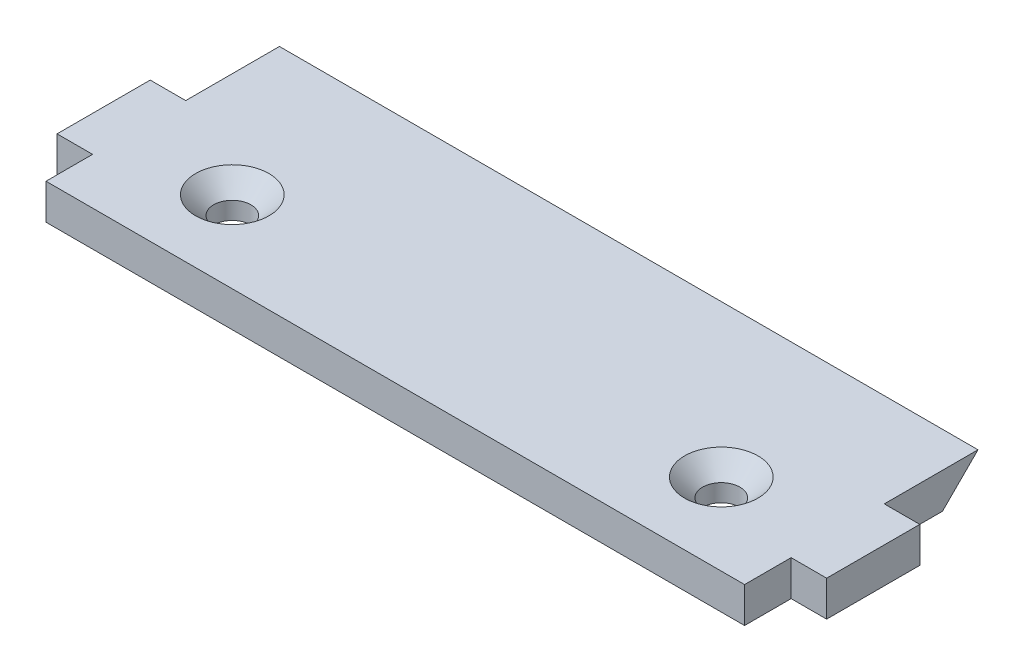
ISO-10303-21;
HEADER;
FILE_DESCRIPTION(('STEP AP214'),'2;1');
FILE_NAME('part.step','',(''),(''),'','','');
FILE_SCHEMA(('AUTOMOTIVE_DESIGN { 1 0 10303 214 1 1 1 1 }'));
ENDSEC;
DATA;
#1=APPLICATION_CONTEXT('core data for automotive mechanical design processes');
#2=APPLICATION_PROTOCOL_DEFINITION('international standard','automotive_design',2000,#1);
#3=PRODUCT_CONTEXT('',#1,'mechanical');
#4=PRODUCT('Part','Part','',(#3));
#5=PRODUCT_RELATED_PRODUCT_CATEGORY('part','',(#4));
#6=PRODUCT_DEFINITION_FORMATION('','',#4);
#7=PRODUCT_DEFINITION_CONTEXT('part definition',#1,'design');
#8=PRODUCT_DEFINITION('design','',#6,#7);
#9=PRODUCT_DEFINITION_SHAPE('','',#8);
#10=(LENGTH_UNIT() NAMED_UNIT(*) SI_UNIT(.MILLI.,.METRE.));
#11=(NAMED_UNIT(*) PLANE_ANGLE_UNIT() SI_UNIT($,.RADIAN.));
#12=(NAMED_UNIT(*) SI_UNIT($,.STERADIAN.) SOLID_ANGLE_UNIT());
#13=UNCERTAINTY_MEASURE_WITH_UNIT(LENGTH_MEASURE(1.E-05),#10,'distance_accuracy_value','');
#14=(GEOMETRIC_REPRESENTATION_CONTEXT(3) GLOBAL_UNCERTAINTY_ASSIGNED_CONTEXT((#13)) GLOBAL_UNIT_ASSIGNED_CONTEXT((#10,
#11,#12)) REPRESENTATION_CONTEXT('',''));
#15=CARTESIAN_POINT('',(0.,0.,0.));
#16=DIRECTION('',(0.,0.,1.));
#17=DIRECTION('',(1.,0.,0.));
#18=AXIS2_PLACEMENT_3D('',#15,#16,#17);
#19=CARTESIAN_POINT('',(66.1,3.05,0.));
#20=DIRECTION('',(-1.,0.,0.));
#21=DIRECTION('',(0.,0.,1.));
#22=AXIS2_PLACEMENT_3D('',#19,#20,#21);
#23=PLANE('',#22);
#24=DIRECTION('',(0.,0.,-1.));
#25=VECTOR('',#24,1.);
#26=CARTESIAN_POINT('',(66.1,0.,0.));
#27=LINE('',#26,#25);
#28=CARTESIAN_POINT('',(66.1,0.,-4.));
#29=VERTEX_POINT('',#28);
#30=CARTESIAN_POINT('',(66.1,0.,-12.));
#31=VERTEX_POINT('',#30);
#32=EDGE_CURVE('E170',#29,#31,#27,.T.);
#33=ORIENTED_EDGE('',*,*,#32,.T.);
#34=DIRECTION('',(0.,-1.,0.));
#35=VECTOR('',#34,1.);
#36=CARTESIAN_POINT('',(66.1,3.05,-12.));
#37=LINE('',#36,#35);
#38=CARTESIAN_POINT('',(66.1,3.05,-12.));
#39=VERTEX_POINT('',#38);
#40=EDGE_CURVE('E53',#39,#31,#37,.T.);
#41=ORIENTED_EDGE('',*,*,#40,.F.);
#42=DIRECTION('',(0.,0.,-1.));
#43=VECTOR('',#42,1.);
#44=CARTESIAN_POINT('',(66.1,3.05,0.));
#45=LINE('',#44,#43);
#46=CARTESIAN_POINT('',(66.1,3.05,-4.));
#47=VERTEX_POINT('',#46);
#48=EDGE_CURVE('E209',#47,#39,#45,.T.);
#49=ORIENTED_EDGE('',*,*,#48,.F.);
#50=DIRECTION('',(0.,-1.,0.));
#51=VECTOR('',#50,1.);
#52=CARTESIAN_POINT('',(66.1,3.05,-4.));
#53=LINE('',#52,#51);
#54=EDGE_CURVE('E68',#47,#29,#53,.T.);
#55=ORIENTED_EDGE('',*,*,#54,.T.);
#56=EDGE_LOOP('',(#33,#41,#49,#55));
#57=FACE_BOUND('',#56,.T.);
#58=ADVANCED_FACE('F45',(#57),#23,.F.);
#59=CARTESIAN_POINT('',(0.,3.05,-12.));
#60=DIRECTION('',(0.,0.,1.));
#61=DIRECTION('',(1.,0.,0.));
#62=AXIS2_PLACEMENT_3D('',#59,#60,#61);
#63=PLANE('',#62);
#64=DIRECTION('',(-1.,0.,0.));
#65=VECTOR('',#64,1.);
#66=CARTESIAN_POINT('',(0.,0.,-12.));
#67=LINE('',#66,#65);
#68=CARTESIAN_POINT('',(63.05,0.,-12.));
#69=VERTEX_POINT('',#68);
#70=EDGE_CURVE('E173',#31,#69,#67,.T.);
#71=ORIENTED_EDGE('',*,*,#70,.T.);
#72=DIRECTION('',(0.,-1.,0.));
#73=VECTOR('',#72,1.);
#74=CARTESIAN_POINT('',(63.05,3.05,-12.));
#75=LINE('',#74,#73);
#76=CARTESIAN_POINT('',(63.05,3.05,-12.));
#77=VERTEX_POINT('',#76);
#78=EDGE_CURVE('E229',#77,#69,#75,.T.);
#79=ORIENTED_EDGE('',*,*,#78,.F.);
#80=DIRECTION('',(-1.,0.,0.));
#81=VECTOR('',#80,1.);
#82=CARTESIAN_POINT('',(0.,3.05,-12.));
#83=LINE('',#82,#81);
#84=EDGE_CURVE('E114',#39,#77,#83,.T.);
#85=ORIENTED_EDGE('',*,*,#84,.F.);
#86=ORIENTED_EDGE('',*,*,#40,.T.);
#87=EDGE_LOOP('',(#71,#79,#85,#86));
#88=FACE_BOUND('',#87,.T.);
#89=ADVANCED_FACE('F234',(#88),#63,.F.);
#90=CARTESIAN_POINT('',(63.0499999999999,3.05,2.17389943175826E-13));
#91=DIRECTION('',(1.,0.,0.));
#92=DIRECTION('',(0.,0.,-1.));
#93=AXIS2_PLACEMENT_3D('',#90,#91,#92);
#94=PLANE('',#93);
#95=DIRECTION('',(0.,-0.707106781186551,0.707106781186544));
#96=VECTOR('',#95,1.);
#97=CARTESIAN_POINT('',(63.05,3.05,-20.05));
#98=LINE('',#97,#96);
#99=CARTESIAN_POINT('',(63.05,3.05,-20.05));
#100=VERTEX_POINT('',#99);
#101=CARTESIAN_POINT('',(63.05,0.,-17.));
#102=VERTEX_POINT('',#101);
#103=EDGE_CURVE('E60',#100,#102,#98,.T.);
#104=ORIENTED_EDGE('',*,*,#103,.F.);
#105=DIRECTION('',(0.,0.,1.));
#106=VECTOR('',#105,1.);
#107=CARTESIAN_POINT('',(63.0499999999999,3.05,2.17389943175826E-13));
#108=LINE('',#107,#106);
#109=EDGE_CURVE('E301',#100,#77,#108,.T.);
#110=ORIENTED_EDGE('',*,*,#109,.T.);
#111=ORIENTED_EDGE('',*,*,#78,.T.);
#112=DIRECTION('',(0.,0.,1.));
#113=VECTOR('',#112,1.);
#114=CARTESIAN_POINT('',(63.0499999999999,0.,2.17389943175826E-13));
#115=LINE('',#114,#113);
#116=EDGE_CURVE('E178',#102,#69,#115,.T.);
#117=ORIENTED_EDGE('',*,*,#116,.F.);
#118=EDGE_LOOP('',(#104,#110,#111,#117));
#119=FACE_BOUND('',#118,.T.);
#120=ADVANCED_FACE('F323',(#119),#94,.T.);
#121=CARTESIAN_POINT('',(3.05,3.05,0.));
#122=DIRECTION('',(1.,0.,0.));
#123=DIRECTION('',(0.,0.,-1.));
#124=AXIS2_PLACEMENT_3D('',#121,#122,#123);
#125=PLANE('',#124);
#126=DIRECTION('',(0.,0.,1.));
#127=VECTOR('',#126,1.);
#128=CARTESIAN_POINT('',(3.05,3.05,0.));
#129=LINE('',#128,#127);
#130=CARTESIAN_POINT('',(3.05,3.05,-20.0500000000002));
#131=VERTEX_POINT('',#130);
#132=CARTESIAN_POINT('',(3.05,3.05,-12.));
#133=VERTEX_POINT('',#132);
#134=EDGE_CURVE('E267',#131,#133,#129,.T.);
#135=ORIENTED_EDGE('',*,*,#134,.F.);
#136=DIRECTION('',(0.,-0.707106781186552,0.707106781186544));
#137=VECTOR('',#136,1.);
#138=CARTESIAN_POINT('',(3.05,-6.97500000000011,-10.0250000000002));
#139=LINE('',#138,#137);
#140=CARTESIAN_POINT('',(3.05,0.,-17.0000000000002));
#141=VERTEX_POINT('',#140);
#142=EDGE_CURVE('E266',#131,#141,#139,.T.);
#143=ORIENTED_EDGE('',*,*,#142,.T.);
#144=DIRECTION('',(0.,0.,1.));
#145=VECTOR('',#144,1.);
#146=CARTESIAN_POINT('',(3.05,0.,0.));
#147=LINE('',#146,#145);
#148=CARTESIAN_POINT('',(3.05,0.,-12.));
#149=VERTEX_POINT('',#148);
#150=EDGE_CURVE('E181',#141,#149,#147,.T.);
#151=ORIENTED_EDGE('',*,*,#150,.T.);
#152=DIRECTION('',(0.,-1.,0.));
#153=VECTOR('',#152,1.);
#154=CARTESIAN_POINT('',(3.05,3.05,-12.));
#155=LINE('',#154,#153);
#156=EDGE_CURVE('E225',#133,#149,#155,.T.);
#157=ORIENTED_EDGE('',*,*,#156,.F.);
#158=EDGE_LOOP('',(#135,#143,#151,#157));
#159=FACE_BOUND('',#158,.T.);
#160=ADVANCED_FACE('F264',(#159),#125,.F.);
#161=CARTESIAN_POINT('',(0.,3.05,-12.));
#162=DIRECTION('',(0.,0.,-1.));
#163=DIRECTION('',(-1.,0.,0.));
#164=AXIS2_PLACEMENT_3D('',#161,#162,#163);
#165=PLANE('',#164);
#166=DIRECTION('',(1.,0.,0.));
#167=VECTOR('',#166,1.);
#168=CARTESIAN_POINT('',(0.,0.,-12.));
#169=LINE('',#168,#167);
#170=CARTESIAN_POINT('',(0.,0.,-12.));
#171=VERTEX_POINT('',#170);
#172=EDGE_CURVE('E184',#171,#149,#169,.T.);
#173=ORIENTED_EDGE('',*,*,#172,.F.);
#174=DIRECTION('',(0.,-1.,0.));
#175=VECTOR('',#174,1.);
#176=CARTESIAN_POINT('',(0.,3.05,-12.));
#177=LINE('',#176,#175);
#178=CARTESIAN_POINT('',(0.,3.05,-12.));
#179=VERTEX_POINT('',#178);
#180=EDGE_CURVE('E222',#179,#171,#177,.T.);
#181=ORIENTED_EDGE('',*,*,#180,.F.);
#182=DIRECTION('',(1.,0.,0.));
#183=VECTOR('',#182,1.);
#184=CARTESIAN_POINT('',(0.,3.05,-12.));
#185=LINE('',#184,#183);
#186=EDGE_CURVE('E310',#179,#133,#185,.T.);
#187=ORIENTED_EDGE('',*,*,#186,.T.);
#188=ORIENTED_EDGE('',*,*,#156,.T.);
#189=EDGE_LOOP('',(#173,#181,#187,#188));
#190=FACE_BOUND('',#189,.T.);
#191=ADVANCED_FACE('F257',(#190),#165,.T.);
#192=CARTESIAN_POINT('',(0.,3.05,0.));
#193=DIRECTION('',(-1.,0.,0.));
#194=DIRECTION('',(0.,0.,1.));
#195=AXIS2_PLACEMENT_3D('',#192,#193,#194);
#196=PLANE('',#195);
#197=DIRECTION('',(0.,0.,-1.));
#198=VECTOR('',#197,1.);
#199=CARTESIAN_POINT('',(0.,0.,0.));
#200=LINE('',#199,#198);
#201=CARTESIAN_POINT('',(0.,0.,-4.));
#202=VERTEX_POINT('',#201);
#203=EDGE_CURVE('E188',#202,#171,#200,.T.);
#204=ORIENTED_EDGE('',*,*,#203,.F.);
#205=DIRECTION('',(0.,-1.,0.));
#206=VECTOR('',#205,1.);
#207=CARTESIAN_POINT('',(0.,3.05,-4.));
#208=LINE('',#207,#206);
#209=CARTESIAN_POINT('',(0.,3.05,-4.));
#210=VERTEX_POINT('',#209);
#211=EDGE_CURVE('E219',#210,#202,#208,.T.);
#212=ORIENTED_EDGE('',*,*,#211,.F.);
#213=DIRECTION('',(0.,0.,-1.));
#214=VECTOR('',#213,1.);
#215=CARTESIAN_POINT('',(0.,3.05,0.));
#216=LINE('',#215,#214);
#217=EDGE_CURVE('E253',#210,#179,#216,.T.);
#218=ORIENTED_EDGE('',*,*,#217,.T.);
#219=ORIENTED_EDGE('',*,*,#180,.T.);
#220=EDGE_LOOP('',(#204,#212,#218,#219));
#221=FACE_BOUND('',#220,.T.);
#222=ADVANCED_FACE('F249',(#221),#196,.T.);
#223=CARTESIAN_POINT('',(0.,3.05,-4.));
#224=DIRECTION('',(0.,0.,-1.));
#225=DIRECTION('',(-1.,0.,0.));
#226=AXIS2_PLACEMENT_3D('',#223,#224,#225);
#227=PLANE('',#226);
#228=DIRECTION('',(1.,0.,0.));
#229=VECTOR('',#228,1.);
#230=CARTESIAN_POINT('',(0.,0.,-4.));
#231=LINE('',#230,#229);
#232=CARTESIAN_POINT('',(3.05,0.,-4.));
#233=VERTEX_POINT('',#232);
#234=EDGE_CURVE('E192',#202,#233,#231,.T.);
#235=ORIENTED_EDGE('',*,*,#234,.T.);
#236=DIRECTION('',(0.,-1.,0.));
#237=VECTOR('',#236,1.);
#238=CARTESIAN_POINT('',(3.05,3.05,-4.));
#239=LINE('',#238,#237);
#240=CARTESIAN_POINT('',(3.05,3.05,-4.));
#241=VERTEX_POINT('',#240);
#242=EDGE_CURVE('E216',#241,#233,#239,.T.);
#243=ORIENTED_EDGE('',*,*,#242,.F.);
#244=DIRECTION('',(1.,0.,0.));
#245=VECTOR('',#244,1.);
#246=CARTESIAN_POINT('',(0.,3.05,-4.));
#247=LINE('',#246,#245);
#248=EDGE_CURVE('E315',#210,#241,#247,.T.);
#249=ORIENTED_EDGE('',*,*,#248,.F.);
#250=ORIENTED_EDGE('',*,*,#211,.T.);
#251=EDGE_LOOP('',(#235,#243,#249,#250));
#252=FACE_BOUND('',#251,.T.);
#253=ADVANCED_FACE('F246',(#252),#227,.F.);
#254=CARTESIAN_POINT('',(3.05,3.05,0.));
#255=DIRECTION('',(-1.,0.,0.));
#256=DIRECTION('',(0.,0.,1.));
#257=AXIS2_PLACEMENT_3D('',#254,#255,#256);
#258=PLANE('',#257);
#259=DIRECTION('',(0.,0.,-1.));
#260=VECTOR('',#259,1.);
#261=CARTESIAN_POINT('',(3.05,0.,0.));
#262=LINE('',#261,#260);
#263=CARTESIAN_POINT('',(3.05,0.,0.));
#264=VERTEX_POINT('',#263);
#265=EDGE_CURVE('E196',#264,#233,#262,.T.);
#266=ORIENTED_EDGE('',*,*,#265,.F.);
#267=DIRECTION('',(0.,-1.,0.));
#268=VECTOR('',#267,1.);
#269=CARTESIAN_POINT('',(3.05,3.05,0.));
#270=LINE('',#269,#268);
#271=CARTESIAN_POINT('',(3.05,3.05,0.));
#272=VERTEX_POINT('',#271);
#273=EDGE_CURVE('E159',#272,#264,#270,.T.);
#274=ORIENTED_EDGE('',*,*,#273,.F.);
#275=DIRECTION('',(0.,0.,-1.));
#276=VECTOR('',#275,1.);
#277=CARTESIAN_POINT('',(3.05,3.05,0.));
#278=LINE('',#277,#276);
#279=EDGE_CURVE('E146',#272,#241,#278,.T.);
#280=ORIENTED_EDGE('',*,*,#279,.T.);
#281=ORIENTED_EDGE('',*,*,#242,.T.);
#282=EDGE_LOOP('',(#266,#274,#280,#281));
#283=FACE_BOUND('',#282,.T.);
#284=ADVANCED_FACE('F242',(#283),#258,.T.);
#285=CARTESIAN_POINT('',(0.,3.05,0.));
#286=DIRECTION('',(0.,0.,-1.));
#287=DIRECTION('',(-1.,0.,0.));
#288=AXIS2_PLACEMENT_3D('',#285,#286,#287);
#289=PLANE('',#288);
#290=DIRECTION('',(1.,0.,0.));
#291=VECTOR('',#290,1.);
#292=CARTESIAN_POINT('',(0.,0.,0.));
#293=LINE('',#292,#291);
#294=CARTESIAN_POINT('',(63.05,0.,0.));
#295=VERTEX_POINT('',#294);
#296=EDGE_CURVE('E154',#264,#295,#293,.T.);
#297=ORIENTED_EDGE('',*,*,#296,.T.);
#298=DIRECTION('',(0.,-1.,0.));
#299=VECTOR('',#298,1.);
#300=CARTESIAN_POINT('',(63.05,3.05,0.));
#301=LINE('',#300,#299);
#302=CARTESIAN_POINT('',(63.05,3.05,0.));
#303=VERTEX_POINT('',#302);
#304=EDGE_CURVE('E151',#303,#295,#301,.T.);
#305=ORIENTED_EDGE('',*,*,#304,.F.);
#306=DIRECTION('',(1.,0.,0.));
#307=VECTOR('',#306,1.);
#308=CARTESIAN_POINT('',(0.,3.05,0.));
#309=LINE('',#308,#307);
#310=EDGE_CURVE('E138',#272,#303,#309,.T.);
#311=ORIENTED_EDGE('',*,*,#310,.F.);
#312=ORIENTED_EDGE('',*,*,#273,.T.);
#313=EDGE_LOOP('',(#297,#305,#311,#312));
#314=FACE_BOUND('',#313,.T.);
#315=ADVANCED_FACE('F152',(#314),#289,.F.);
#316=CARTESIAN_POINT('',(63.05,3.05,0.));
#317=DIRECTION('',(-1.,0.,0.));
#318=DIRECTION('',(0.,0.,1.));
#319=AXIS2_PLACEMENT_3D('',#316,#317,#318);
#320=PLANE('',#319);
#321=DIRECTION('',(0.,0.,-1.));
#322=VECTOR('',#321,1.);
#323=CARTESIAN_POINT('',(63.05,0.,0.));
#324=LINE('',#323,#322);
#325=CARTESIAN_POINT('',(63.05,0.,-4.));
#326=VERTEX_POINT('',#325);
#327=EDGE_CURVE('E202',#295,#326,#324,.T.);
#328=ORIENTED_EDGE('',*,*,#327,.T.);
#329=DIRECTION('',(0.,-1.,0.));
#330=VECTOR('',#329,1.);
#331=CARTESIAN_POINT('',(63.05,3.05,-4.));
#332=LINE('',#331,#330);
#333=CARTESIAN_POINT('',(63.05,3.05,-4.));
#334=VERTEX_POINT('',#333);
#335=EDGE_CURVE('E160',#334,#326,#332,.T.);
#336=ORIENTED_EDGE('',*,*,#335,.F.);
#337=DIRECTION('',(0.,0.,-1.));
#338=VECTOR('',#337,1.);
#339=CARTESIAN_POINT('',(63.05,3.05,0.));
#340=LINE('',#339,#338);
#341=EDGE_CURVE('E143',#303,#334,#340,.T.);
#342=ORIENTED_EDGE('',*,*,#341,.F.);
#343=ORIENTED_EDGE('',*,*,#304,.T.);
#344=EDGE_LOOP('',(#328,#336,#342,#343));
#345=FACE_BOUND('',#344,.T.);
#346=ADVANCED_FACE('F162',(#345),#320,.F.);
#347=CARTESIAN_POINT('',(0.,3.05,-4.));
#348=DIRECTION('',(0.,0.,1.));
#349=DIRECTION('',(1.,0.,0.));
#350=AXIS2_PLACEMENT_3D('',#347,#348,#349);
#351=PLANE('',#350);
#352=DIRECTION('',(-1.,0.,0.));
#353=VECTOR('',#352,1.);
#354=CARTESIAN_POINT('',(0.,0.,-4.));
#355=LINE('',#354,#353);
#356=EDGE_CURVE('E205',#29,#326,#355,.T.);
#357=ORIENTED_EDGE('',*,*,#356,.F.);
#358=ORIENTED_EDGE('',*,*,#54,.F.);
#359=DIRECTION('',(-1.,0.,0.));
#360=VECTOR('',#359,1.);
#361=CARTESIAN_POINT('',(0.,3.05,-4.));
#362=LINE('',#361,#360);
#363=EDGE_CURVE('E164',#47,#334,#362,.T.);
#364=ORIENTED_EDGE('',*,*,#363,.T.);
#365=ORIENTED_EDGE('',*,*,#335,.T.);
#366=EDGE_LOOP('',(#357,#358,#364,#365));
#367=FACE_BOUND('',#366,.T.);
#368=ADVANCED_FACE('F238',(#367),#351,.T.);
#369=CARTESIAN_POINT('',(0.,3.05,0.));
#370=DIRECTION('',(0.,1.,0.));
#371=DIRECTION('',(0.,0.,1.));
#372=AXIS2_PLACEMENT_3D('',#369,#370,#371);
#373=PLANE('',#372);
#374=CARTESIAN_POINT('',(54.05,3.05,-7.));
#375=DIRECTION('',(0.,1.,0.));
#376=DIRECTION('',(0.,0.,1.));
#377=AXIS2_PLACEMENT_3D('',#374,#375,#376);
#378=CIRCLE('',#377,3.15);
#379=CARTESIAN_POINT('',(54.05,3.05,-3.85));
#380=VERTEX_POINT('',#379);
#381=EDGE_CURVE('E270',#380,#380,#378,.T.);
#382=ORIENTED_EDGE('',*,*,#381,.F.);
#383=EDGE_LOOP('',(#382));
#384=FACE_BOUND('',#383,.T.);
#385=CARTESIAN_POINT('',(12.05,3.05,-7.));
#386=DIRECTION('',(0.,1.,0.));
#387=DIRECTION('',(0.,0.,1.));
#388=AXIS2_PLACEMENT_3D('',#385,#386,#387);
#389=CIRCLE('',#388,3.15);
#390=CARTESIAN_POINT('',(12.05,3.05,-3.85));
#391=VERTEX_POINT('',#390);
#392=EDGE_CURVE('E286',#391,#391,#389,.T.);
#393=ORIENTED_EDGE('',*,*,#392,.F.);
#394=EDGE_LOOP('',(#393));
#395=FACE_BOUND('',#394,.T.);
#396=ORIENTED_EDGE('',*,*,#48,.T.);
#397=ORIENTED_EDGE('',*,*,#84,.T.);
#398=ORIENTED_EDGE('',*,*,#109,.F.);
#399=DIRECTION('',(1.,0.,0.));
#400=VECTOR('',#399,1.);
#401=CARTESIAN_POINT('',(0.,3.05,-20.05));
#402=LINE('',#401,#400);
#403=EDGE_CURVE('E305',#131,#100,#402,.T.);
#404=ORIENTED_EDGE('',*,*,#403,.F.);
#405=ORIENTED_EDGE('',*,*,#134,.T.);
#406=ORIENTED_EDGE('',*,*,#186,.F.);
#407=ORIENTED_EDGE('',*,*,#217,.F.);
#408=ORIENTED_EDGE('',*,*,#248,.T.);
#409=ORIENTED_EDGE('',*,*,#279,.F.);
#410=ORIENTED_EDGE('',*,*,#310,.T.);
#411=ORIENTED_EDGE('',*,*,#341,.T.);
#412=ORIENTED_EDGE('',*,*,#363,.F.);
#413=EDGE_LOOP('',(#396,#397,#398,#404,#405,#406,#407,#408,#409,#410,#411,#412));
#414=FACE_BOUND('',#413,.T.);
#415=ADVANCED_FACE('F140',(#384,#395,#414),#373,.T.);
#416=CARTESIAN_POINT('',(0.,0.,0.));
#417=DIRECTION('',(0.,1.,0.));
#418=DIRECTION('',(0.,0.,1.));
#419=AXIS2_PLACEMENT_3D('',#416,#417,#418);
#420=PLANE('',#419);
#421=CARTESIAN_POINT('',(54.05,0.,-7.));
#422=DIRECTION('',(0.,1.,0.));
#423=DIRECTION('',(0.,0.,1.));
#424=AXIS2_PLACEMENT_3D('',#421,#422,#423);
#425=CIRCLE('',#424,1.6);
#426=CARTESIAN_POINT('',(54.05,0.,-5.4));
#427=VERTEX_POINT('',#426);
#428=EDGE_CURVE('E282',#427,#427,#425,.T.);
#429=ORIENTED_EDGE('',*,*,#428,.T.);
#430=EDGE_LOOP('',(#429));
#431=FACE_BOUND('',#430,.T.);
#432=CARTESIAN_POINT('',(12.05,0.,-7.));
#433=DIRECTION('',(0.,1.,0.));
#434=DIRECTION('',(0.,0.,1.));
#435=AXIS2_PLACEMENT_3D('',#432,#433,#434);
#436=CIRCLE('',#435,1.6);
#437=CARTESIAN_POINT('',(12.05,0.,-5.4));
#438=VERTEX_POINT('',#437);
#439=EDGE_CURVE('E174',#438,#438,#436,.T.);
#440=ORIENTED_EDGE('',*,*,#439,.T.);
#441=EDGE_LOOP('',(#440));
#442=FACE_BOUND('',#441,.T.);
#443=ORIENTED_EDGE('',*,*,#150,.F.);
#444=DIRECTION('',(1.,0.,0.));
#445=VECTOR('',#444,1.);
#446=CARTESIAN_POINT('',(0.,0.,-17.0000000000003));
#447=LINE('',#446,#445);
#448=EDGE_CURVE('E11',#141,#102,#447,.T.);
#449=ORIENTED_EDGE('',*,*,#448,.T.);
#450=ORIENTED_EDGE('',*,*,#116,.T.);
#451=ORIENTED_EDGE('',*,*,#70,.F.);
#452=ORIENTED_EDGE('',*,*,#32,.F.);
#453=ORIENTED_EDGE('',*,*,#356,.T.);
#454=ORIENTED_EDGE('',*,*,#327,.F.);
#455=ORIENTED_EDGE('',*,*,#296,.F.);
#456=ORIENTED_EDGE('',*,*,#265,.T.);
#457=ORIENTED_EDGE('',*,*,#234,.F.);
#458=ORIENTED_EDGE('',*,*,#203,.T.);
#459=ORIENTED_EDGE('',*,*,#172,.T.);
#460=EDGE_LOOP('',(#443,#449,#450,#451,#452,#453,#454,#455,#456,#457,#458,#459));
#461=FACE_BOUND('',#460,.T.);
#462=ADVANCED_FACE('F237',(#431,#442,#461),#420,.F.);
#463=CARTESIAN_POINT('',(12.05,3.05,-7.));
#464=DIRECTION('',(0.,1.,0.));
#465=DIRECTION('',(0.,0.,1.));
#466=AXIS2_PLACEMENT_3D('',#463,#464,#465);
#467=CYLINDRICAL_SURFACE('',#466,1.6);
#468=ORIENTED_EDGE('',*,*,#439,.F.);
#469=EDGE_LOOP('',(#468));
#470=FACE_BOUND('',#469,.T.);
#471=CARTESIAN_POINT('',(12.05,1.5,-7.));
#472=DIRECTION('',(0.,1.,0.));
#473=DIRECTION('',(0.,0.,1.));
#474=AXIS2_PLACEMENT_3D('',#471,#472,#473);
#475=CIRCLE('',#474,1.6);
#476=CARTESIAN_POINT('',(12.05,1.5,-5.4));
#477=VERTEX_POINT('',#476);
#478=EDGE_CURVE('E290',#477,#477,#475,.T.);
#479=ORIENTED_EDGE('',*,*,#478,.T.);
#480=EDGE_LOOP('',(#479));
#481=FACE_BOUND('',#480,.T.);
#482=ADVANCED_FACE('F412',(#470,#481),#467,.F.);
#483=CARTESIAN_POINT('',(12.05,3.05,-7.));
#484=DIRECTION('',(0.,1.,0.));
#485=DIRECTION('',(0.,0.,1.));
#486=AXIS2_PLACEMENT_3D('',#483,#484,#485);
#487=CONICAL_SURFACE('',#486,3.15,0.785398163397449);
#488=ORIENTED_EDGE('',*,*,#478,.F.);
#489=EDGE_LOOP('',(#488));
#490=FACE_BOUND('',#489,.T.);
#491=ORIENTED_EDGE('',*,*,#392,.T.);
#492=EDGE_LOOP('',(#491));
#493=FACE_BOUND('',#492,.T.);
#494=ADVANCED_FACE('F417',(#490,#493),#487,.F.);
#495=CARTESIAN_POINT('',(54.05,3.05,-7.));
#496=DIRECTION('',(0.,1.,0.));
#497=DIRECTION('',(0.,0.,1.));
#498=AXIS2_PLACEMENT_3D('',#495,#496,#497);
#499=CYLINDRICAL_SURFACE('',#498,1.6);
#500=ORIENTED_EDGE('',*,*,#428,.F.);
#501=EDGE_LOOP('',(#500));
#502=FACE_BOUND('',#501,.T.);
#503=CARTESIAN_POINT('',(54.05,1.5,-7.));
#504=DIRECTION('',(0.,1.,0.));
#505=DIRECTION('',(0.,0.,1.));
#506=AXIS2_PLACEMENT_3D('',#503,#504,#505);
#507=CIRCLE('',#506,1.6);
#508=CARTESIAN_POINT('',(54.05,1.5,-5.4));
#509=VERTEX_POINT('',#508);
#510=EDGE_CURVE('E275',#509,#509,#507,.T.);
#511=ORIENTED_EDGE('',*,*,#510,.T.);
#512=EDGE_LOOP('',(#511));
#513=FACE_BOUND('',#512,.T.);
#514=ADVANCED_FACE('F430',(#502,#513),#499,.F.);
#515=CARTESIAN_POINT('',(54.05,3.05,-7.));
#516=DIRECTION('',(0.,1.,0.));
#517=DIRECTION('',(0.,0.,1.));
#518=AXIS2_PLACEMENT_3D('',#515,#516,#517);
#519=CONICAL_SURFACE('',#518,3.15,0.785398163397449);
#520=ORIENTED_EDGE('',*,*,#510,.F.);
#521=EDGE_LOOP('',(#520));
#522=FACE_BOUND('',#521,.T.);
#523=ORIENTED_EDGE('',*,*,#381,.T.);
#524=EDGE_LOOP('',(#523));
#525=FACE_BOUND('',#524,.T.);
#526=ADVANCED_FACE('F441',(#522,#525),#519,.F.);
#527=CARTESIAN_POINT('',(0.,3.05,-20.0500000000002));
#528=DIRECTION('',(0.,0.707106781186543,0.707106781186551));
#529=DIRECTION('',(0.,-0.707106781186552,0.707106781186544));
#530=AXIS2_PLACEMENT_3D('',#527,#528,#529);
#531=PLANE('',#530);
#532=ORIENTED_EDGE('',*,*,#403,.T.);
#533=ORIENTED_EDGE('',*,*,#103,.T.);
#534=ORIENTED_EDGE('',*,*,#448,.F.);
#535=ORIENTED_EDGE('',*,*,#142,.F.);
#536=EDGE_LOOP('',(#532,#533,#534,#535));
#537=FACE_BOUND('',#536,.T.);
#538=ADVANCED_FACE('F320',(#537),#531,.F.);
#539=CLOSED_SHELL('',(#58,#89,#120,#160,#191,#222,#253,#284,#315,#346,#368,#415,#462,#482,#494,
#514,#526,#538));
#540=MANIFOLD_SOLID_BREP('B2',#539);
#541=ADVANCED_BREP_SHAPE_REPRESENTATION('',(#18,#540),#14);
#542=SHAPE_DEFINITION_REPRESENTATION(#9,#541);
ENDSEC;
END-ISO-10303-21;
